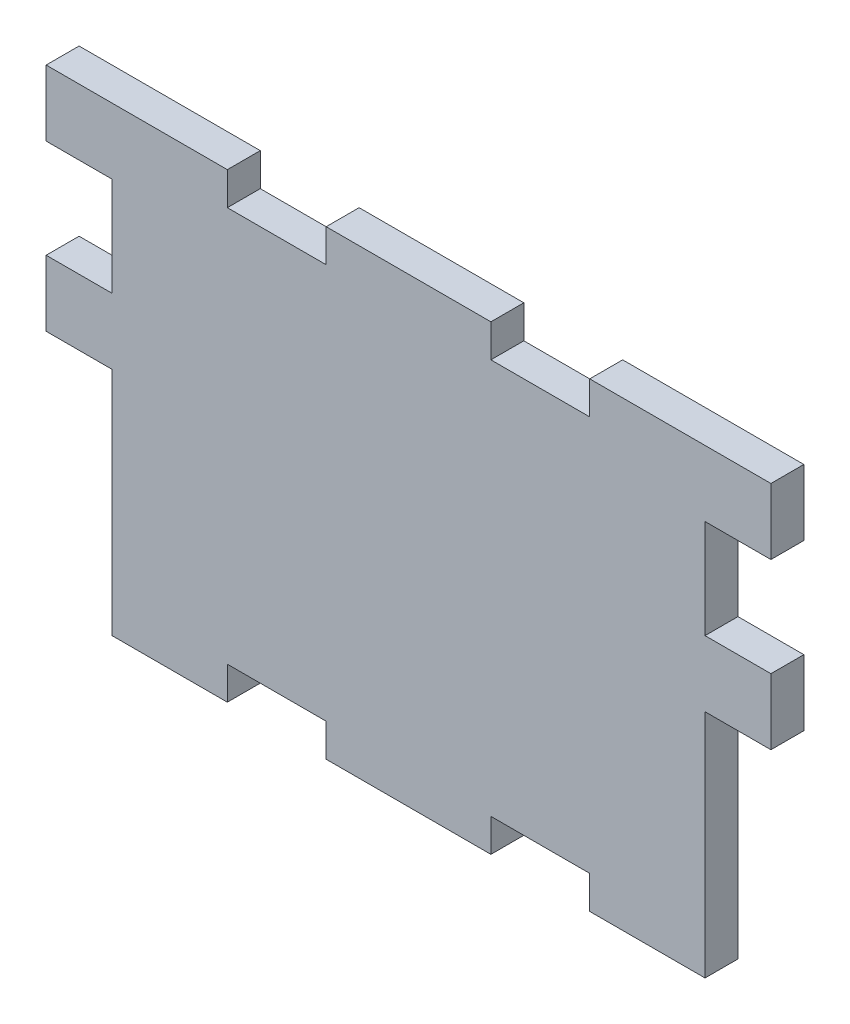
ISO-10303-21;
HEADER;
FILE_DESCRIPTION(('STEP AP214'),'2;1');
FILE_NAME('part.step','',(''),(''),'','','');
FILE_SCHEMA(('AUTOMOTIVE_DESIGN { 1 0 10303 214 1 1 1 1 }'));
ENDSEC;
DATA;
#1=APPLICATION_CONTEXT('core data for automotive mechanical design processes');
#2=APPLICATION_PROTOCOL_DEFINITION('international standard','automotive_design',2000,#1);
#3=PRODUCT_CONTEXT('',#1,'mechanical');
#4=PRODUCT('Part','Part','',(#3));
#5=PRODUCT_RELATED_PRODUCT_CATEGORY('part','',(#4));
#6=PRODUCT_DEFINITION_FORMATION('','',#4);
#7=PRODUCT_DEFINITION_CONTEXT('part definition',#1,'design');
#8=PRODUCT_DEFINITION('design','',#6,#7);
#9=PRODUCT_DEFINITION_SHAPE('','',#8);
#10=(LENGTH_UNIT() NAMED_UNIT(*) SI_UNIT(.MILLI.,.METRE.));
#11=(NAMED_UNIT(*) PLANE_ANGLE_UNIT() SI_UNIT($,.RADIAN.));
#12=(NAMED_UNIT(*) SI_UNIT($,.STERADIAN.) SOLID_ANGLE_UNIT());
#13=UNCERTAINTY_MEASURE_WITH_UNIT(LENGTH_MEASURE(1.E-05),#10,'distance_accuracy_value','');
#14=(GEOMETRIC_REPRESENTATION_CONTEXT(3) GLOBAL_UNCERTAINTY_ASSIGNED_CONTEXT((#13)) GLOBAL_UNIT_ASSIGNED_CONTEXT((#10,
#11,#12)) REPRESENTATION_CONTEXT('',''));
#15=CARTESIAN_POINT('',(0.,0.,0.));
#16=DIRECTION('',(0.,0.,1.));
#17=DIRECTION('',(1.,0.,0.));
#18=AXIS2_PLACEMENT_3D('',#15,#16,#17);
#19=CARTESIAN_POINT('',(55.,35.,5.));
#20=DIRECTION('',(-1.,0.,0.));
#21=DIRECTION('',(0.,-1.,0.));
#22=AXIS2_PLACEMENT_3D('',#19,#20,#21);
#23=PLANE('',#22);
#24=DIRECTION('',(0.,1.,0.));
#25=VECTOR('',#24,1.);
#26=CARTESIAN_POINT('',(55.,35.,5.));
#27=LINE('',#26,#25);
#28=CARTESIAN_POINT('',(55.,25.,5.));
#29=VERTEX_POINT('',#28);
#30=CARTESIAN_POINT('',(55.,35.,5.));
#31=VERTEX_POINT('',#30);
#32=EDGE_CURVE('E523',#29,#31,#27,.T.);
#33=ORIENTED_EDGE('',*,*,#32,.F.);
#34=DIRECTION('',(0.,0.,-1.));
#35=VECTOR('',#34,1.);
#36=CARTESIAN_POINT('',(55.,25.,5.));
#37=LINE('',#36,#35);
#38=CARTESIAN_POINT('',(55.,25.,0.));
#39=VERTEX_POINT('',#38);
#40=EDGE_CURVE('E393',#29,#39,#37,.T.);
#41=ORIENTED_EDGE('',*,*,#40,.T.);
#42=DIRECTION('',(0.,1.,0.));
#43=VECTOR('',#42,1.);
#44=CARTESIAN_POINT('',(55.,35.,0.));
#45=LINE('',#44,#43);
#46=CARTESIAN_POINT('',(55.,35.,0.));
#47=VERTEX_POINT('',#46);
#48=EDGE_CURVE('E517',#39,#47,#45,.T.);
#49=ORIENTED_EDGE('',*,*,#48,.T.);
#50=DIRECTION('',(0.,0.,-1.));
#51=VECTOR('',#50,1.);
#52=CARTESIAN_POINT('',(55.,35.,5.));
#53=LINE('',#52,#51);
#54=EDGE_CURVE('E11',#31,#47,#53,.T.);
#55=ORIENTED_EDGE('',*,*,#54,.F.);
#56=EDGE_LOOP('',(#33,#41,#49,#55));
#57=FACE_BOUND('',#56,.T.);
#58=ADVANCED_FACE('F43',(#57),#23,.F.);
#59=CARTESIAN_POINT('',(-55.,35.,5.));
#60=DIRECTION('',(0.,-1.,0.));
#61=DIRECTION('',(0.,0.,-1.));
#62=AXIS2_PLACEMENT_3D('',#59,#60,#61);
#63=PLANE('',#62);
#64=DIRECTION('',(-1.,0.,0.));
#65=VECTOR('',#64,1.);
#66=CARTESIAN_POINT('',(-55.,35.,0.));
#67=LINE('',#66,#65);
#68=CARTESIAN_POINT('',(27.5,35.,0.));
#69=VERTEX_POINT('',#68);
#70=EDGE_CURVE('E548',#47,#69,#67,.T.);
#71=ORIENTED_EDGE('',*,*,#70,.T.);
#72=DIRECTION('',(0.,0.,-1.));
#73=VECTOR('',#72,1.);
#74=CARTESIAN_POINT('',(27.5,35.,5.));
#75=LINE('',#74,#73);
#76=CARTESIAN_POINT('',(27.5,35.,5.));
#77=VERTEX_POINT('',#76);
#78=EDGE_CURVE('E325',#77,#69,#75,.T.);
#79=ORIENTED_EDGE('',*,*,#78,.F.);
#80=DIRECTION('',(-1.,0.,0.));
#81=VECTOR('',#80,1.);
#82=CARTESIAN_POINT('',(-55.,35.,5.));
#83=LINE('',#82,#81);
#84=EDGE_CURVE('E528',#31,#77,#83,.T.);
#85=ORIENTED_EDGE('',*,*,#84,.F.);
#86=ORIENTED_EDGE('',*,*,#54,.T.);
#87=EDGE_LOOP('',(#71,#79,#85,#86));
#88=FACE_BOUND('',#87,.T.);
#89=ADVANCED_FACE('F683',(#88),#63,.F.);
#90=CARTESIAN_POINT('',(12.5,35.,5.));
#91=VERTEX_POINT('',#90);
#92=CARTESIAN_POINT('',(-12.5,35.,5.));
#93=VERTEX_POINT('',#92);
#94=EDGE_CURVE('E533',#91,#93,#83,.T.);
#95=ORIENTED_EDGE('',*,*,#94,.F.);
#96=DIRECTION('',(0.,0.,-1.));
#97=VECTOR('',#96,1.);
#98=CARTESIAN_POINT('',(12.5,35.,5.));
#99=LINE('',#98,#97);
#100=CARTESIAN_POINT('',(12.5,35.,0.));
#101=VERTEX_POINT('',#100);
#102=EDGE_CURVE('E411',#91,#101,#99,.T.);
#103=ORIENTED_EDGE('',*,*,#102,.T.);
#104=CARTESIAN_POINT('',(-12.5,35.,0.));
#105=VERTEX_POINT('',#104);
#106=EDGE_CURVE('E553',#101,#105,#67,.T.);
#107=ORIENTED_EDGE('',*,*,#106,.T.);
#108=DIRECTION('',(0.,0.,-1.));
#109=VECTOR('',#108,1.);
#110=CARTESIAN_POINT('',(-12.5,35.,5.));
#111=LINE('',#110,#109);
#112=EDGE_CURVE('E311',#93,#105,#111,.T.);
#113=ORIENTED_EDGE('',*,*,#112,.F.);
#114=EDGE_LOOP('',(#95,#103,#107,#113));
#115=FACE_BOUND('',#114,.T.);
#116=ADVANCED_FACE('F616',(#115),#63,.F.);
#117=CARTESIAN_POINT('',(-55.,35.,5.));
#118=DIRECTION('',(1.,0.,0.));
#119=DIRECTION('',(0.,1.,0.));
#120=AXIS2_PLACEMENT_3D('',#117,#118,#119);
#121=PLANE('',#120);
#122=DIRECTION('',(0.,-1.,0.));
#123=VECTOR('',#122,1.);
#124=CARTESIAN_POINT('',(-55.,35.,5.));
#125=LINE('',#124,#123);
#126=CARTESIAN_POINT('',(-55.,10.,5.));
#127=VERTEX_POINT('',#126);
#128=CARTESIAN_POINT('',(-55.,0.,5.));
#129=VERTEX_POINT('',#128);
#130=EDGE_CURVE('E532',#127,#129,#125,.T.);
#131=ORIENTED_EDGE('',*,*,#130,.F.);
#132=DIRECTION('',(0.,0.,-1.));
#133=VECTOR('',#132,1.);
#134=CARTESIAN_POINT('',(-55.,10.,5.));
#135=LINE('',#134,#133);
#136=CARTESIAN_POINT('',(-55.,10.,0.));
#137=VERTEX_POINT('',#136);
#138=EDGE_CURVE('E377',#127,#137,#135,.T.);
#139=ORIENTED_EDGE('',*,*,#138,.T.);
#140=DIRECTION('',(0.,-1.,0.));
#141=VECTOR('',#140,1.);
#142=CARTESIAN_POINT('',(-55.,35.,0.));
#143=LINE('',#142,#141);
#144=CARTESIAN_POINT('',(-55.,0.,0.));
#145=VERTEX_POINT('',#144);
#146=EDGE_CURVE('E552',#137,#145,#143,.T.);
#147=ORIENTED_EDGE('',*,*,#146,.T.);
#148=DIRECTION('',(0.,0.,-1.));
#149=VECTOR('',#148,1.);
#150=CARTESIAN_POINT('',(-55.,0.,5.));
#151=LINE('',#150,#149);
#152=EDGE_CURVE('E437',#129,#145,#151,.T.);
#153=ORIENTED_EDGE('',*,*,#152,.F.);
#154=EDGE_LOOP('',(#131,#139,#147,#153));
#155=FACE_BOUND('',#154,.T.);
#156=ADVANCED_FACE('F648',(#155),#121,.F.);
#157=CARTESIAN_POINT('',(-55.,-35.,5.));
#158=DIRECTION('',(0.,1.,0.));
#159=DIRECTION('',(0.,0.,1.));
#160=AXIS2_PLACEMENT_3D('',#157,#158,#159);
#161=PLANE('',#160);
#162=DIRECTION('',(1.,0.,0.));
#163=VECTOR('',#162,1.);
#164=CARTESIAN_POINT('',(-55.,-35.,5.));
#165=LINE('',#164,#163);
#166=CARTESIAN_POINT('',(-12.5,-35.,5.));
#167=VERTEX_POINT('',#166);
#168=CARTESIAN_POINT('',(12.5,-35.,5.));
#169=VERTEX_POINT('',#168);
#170=EDGE_CURVE('E543',#167,#169,#165,.T.);
#171=ORIENTED_EDGE('',*,*,#170,.F.);
#172=DIRECTION('',(0.,0.,-1.));
#173=VECTOR('',#172,1.);
#174=CARTESIAN_POINT('',(-12.5,-35.,5.));
#175=LINE('',#174,#173);
#176=CARTESIAN_POINT('',(-12.5,-35.,0.));
#177=VERTEX_POINT('',#176);
#178=EDGE_CURVE('E294',#167,#177,#175,.T.);
#179=ORIENTED_EDGE('',*,*,#178,.T.);
#180=DIRECTION('',(1.,0.,0.));
#181=VECTOR('',#180,1.);
#182=CARTESIAN_POINT('',(-55.,-35.,0.));
#183=LINE('',#182,#181);
#184=CARTESIAN_POINT('',(12.5,-35.,0.));
#185=VERTEX_POINT('',#184);
#186=EDGE_CURVE('E280',#177,#185,#183,.T.);
#187=ORIENTED_EDGE('',*,*,#186,.T.);
#188=DIRECTION('',(0.,0.,-1.));
#189=VECTOR('',#188,1.);
#190=CARTESIAN_POINT('',(12.5,-35.,5.));
#191=LINE('',#190,#189);
#192=EDGE_CURVE('E341',#169,#185,#191,.T.);
#193=ORIENTED_EDGE('',*,*,#192,.F.);
#194=EDGE_LOOP('',(#171,#179,#187,#193));
#195=FACE_BOUND('',#194,.T.);
#196=ADVANCED_FACE('F578',(#195),#161,.F.);
#197=CARTESIAN_POINT('',(27.5,-35.,5.));
#198=VERTEX_POINT('',#197);
#199=CARTESIAN_POINT('',(45.,-35.,5.));
#200=VERTEX_POINT('',#199);
#201=EDGE_CURVE('E539',#198,#200,#165,.T.);
#202=ORIENTED_EDGE('',*,*,#201,.F.);
#203=DIRECTION('',(0.,0.,-1.));
#204=VECTOR('',#203,1.);
#205=CARTESIAN_POINT('',(27.5,-35.,5.));
#206=LINE('',#205,#204);
#207=CARTESIAN_POINT('',(27.5,-35.,0.));
#208=VERTEX_POINT('',#207);
#209=EDGE_CURVE('E336',#198,#208,#206,.T.);
#210=ORIENTED_EDGE('',*,*,#209,.T.);
#211=CARTESIAN_POINT('',(45.,-35.,0.));
#212=VERTEX_POINT('',#211);
#213=EDGE_CURVE('E559',#208,#212,#183,.T.);
#214=ORIENTED_EDGE('',*,*,#213,.T.);
#215=DIRECTION('',(0.,0.,-1.));
#216=VECTOR('',#215,1.);
#217=CARTESIAN_POINT('',(45.,-35.,5.));
#218=LINE('',#217,#216);
#219=EDGE_CURVE('E507',#200,#212,#218,.T.);
#220=ORIENTED_EDGE('',*,*,#219,.F.);
#221=EDGE_LOOP('',(#202,#210,#214,#220));
#222=FACE_BOUND('',#221,.T.);
#223=ADVANCED_FACE('F592',(#222),#161,.F.);
#224=CARTESIAN_POINT('',(55.,0.,0.));
#225=VERTEX_POINT('',#224);
#226=CARTESIAN_POINT('',(55.,10.,0.));
#227=VERTEX_POINT('',#226);
#228=EDGE_CURVE('E547',#225,#227,#45,.T.);
#229=ORIENTED_EDGE('',*,*,#228,.T.);
#230=DIRECTION('',(0.,0.,-1.));
#231=VECTOR('',#230,1.);
#232=CARTESIAN_POINT('',(55.,10.,5.));
#233=LINE('',#232,#231);
#234=CARTESIAN_POINT('',(55.,10.,5.));
#235=VERTEX_POINT('',#234);
#236=EDGE_CURVE('E464',#235,#227,#233,.T.);
#237=ORIENTED_EDGE('',*,*,#236,.F.);
#238=CARTESIAN_POINT('',(55.,0.,5.));
#239=VERTEX_POINT('',#238);
#240=EDGE_CURVE('E526',#239,#235,#27,.T.);
#241=ORIENTED_EDGE('',*,*,#240,.F.);
#242=DIRECTION('',(0.,0.,-1.));
#243=VECTOR('',#242,1.);
#244=CARTESIAN_POINT('',(55.,0.,5.));
#245=LINE('',#244,#243);
#246=EDGE_CURVE('E513',#239,#225,#245,.T.);
#247=ORIENTED_EDGE('',*,*,#246,.T.);
#248=EDGE_LOOP('',(#229,#237,#241,#247));
#249=FACE_BOUND('',#248,.T.);
#250=ADVANCED_FACE('F45',(#249),#23,.F.);
#251=CARTESIAN_POINT('',(-27.5,35.,5.));
#252=VERTEX_POINT('',#251);
#253=CARTESIAN_POINT('',(-55.,35.,5.));
#254=VERTEX_POINT('',#253);
#255=EDGE_CURVE('E534',#252,#254,#83,.T.);
#256=ORIENTED_EDGE('',*,*,#255,.F.);
#257=DIRECTION('',(0.,0.,-1.));
#258=VECTOR('',#257,1.);
#259=CARTESIAN_POINT('',(-27.5,35.,5.));
#260=LINE('',#259,#258);
#261=CARTESIAN_POINT('',(-27.5,35.,0.));
#262=VERTEX_POINT('',#261);
#263=EDGE_CURVE('E307',#252,#262,#260,.T.);
#264=ORIENTED_EDGE('',*,*,#263,.T.);
#265=CARTESIAN_POINT('',(-55.,35.,0.));
#266=VERTEX_POINT('',#265);
#267=EDGE_CURVE('E554',#262,#266,#67,.T.);
#268=ORIENTED_EDGE('',*,*,#267,.T.);
#269=DIRECTION('',(0.,0.,-1.));
#270=VECTOR('',#269,1.);
#271=CARTESIAN_POINT('',(-55.,35.,5.));
#272=LINE('',#271,#270);
#273=EDGE_CURVE('E52',#254,#266,#272,.T.);
#274=ORIENTED_EDGE('',*,*,#273,.F.);
#275=EDGE_LOOP('',(#256,#264,#268,#274));
#276=FACE_BOUND('',#275,.T.);
#277=ADVANCED_FACE('F630',(#276),#63,.F.);
#278=CARTESIAN_POINT('',(-55.,25.,0.));
#279=VERTEX_POINT('',#278);
#280=EDGE_CURVE('E555',#266,#279,#143,.T.);
#281=ORIENTED_EDGE('',*,*,#280,.T.);
#282=DIRECTION('',(0.,0.,-1.));
#283=VECTOR('',#282,1.);
#284=CARTESIAN_POINT('',(-55.,25.,5.));
#285=LINE('',#284,#283);
#286=CARTESIAN_POINT('',(-55.,25.,5.));
#287=VERTEX_POINT('',#286);
#288=EDGE_CURVE('E367',#287,#279,#285,.T.);
#289=ORIENTED_EDGE('',*,*,#288,.F.);
#290=EDGE_CURVE('E535',#254,#287,#125,.T.);
#291=ORIENTED_EDGE('',*,*,#290,.F.);
#292=ORIENTED_EDGE('',*,*,#273,.T.);
#293=EDGE_LOOP('',(#281,#289,#291,#292));
#294=FACE_BOUND('',#293,.T.);
#295=ADVANCED_FACE('F632',(#294),#121,.F.);
#296=CARTESIAN_POINT('',(-45.,-35.,5.));
#297=VERTEX_POINT('',#296);
#298=CARTESIAN_POINT('',(-27.5,-35.,5.));
#299=VERTEX_POINT('',#298);
#300=EDGE_CURVE('E544',#297,#299,#165,.T.);
#301=ORIENTED_EDGE('',*,*,#300,.F.);
#302=DIRECTION('',(0.,0.,-1.));
#303=VECTOR('',#302,1.);
#304=CARTESIAN_POINT('',(-45.,-35.,5.));
#305=LINE('',#304,#303);
#306=CARTESIAN_POINT('',(-45.,-35.,0.));
#307=VERTEX_POINT('',#306);
#308=EDGE_CURVE('E444',#297,#307,#305,.T.);
#309=ORIENTED_EDGE('',*,*,#308,.T.);
#310=CARTESIAN_POINT('',(-27.5,-35.,0.));
#311=VERTEX_POINT('',#310);
#312=EDGE_CURVE('E527',#307,#311,#183,.T.);
#313=ORIENTED_EDGE('',*,*,#312,.T.);
#314=DIRECTION('',(0.,0.,-1.));
#315=VECTOR('',#314,1.);
#316=CARTESIAN_POINT('',(-27.5,-35.,5.));
#317=LINE('',#316,#315);
#318=EDGE_CURVE('E664',#299,#311,#317,.T.);
#319=ORIENTED_EDGE('',*,*,#318,.F.);
#320=EDGE_LOOP('',(#301,#309,#313,#319));
#321=FACE_BOUND('',#320,.T.);
#322=ADVANCED_FACE('F662',(#321),#161,.F.);
#323=CARTESIAN_POINT('',(0.,0.,5.));
#324=DIRECTION('',(0.,0.,1.));
#325=DIRECTION('',(1.,0.,0.));
#326=AXIS2_PLACEMENT_3D('',#323,#324,#325);
#327=PLANE('',#326);
#328=DIRECTION('',(0.,-1.,0.));
#329=VECTOR('',#328,1.);
#330=CARTESIAN_POINT('',(27.5,35.,5.));
#331=LINE('',#330,#329);
#332=CARTESIAN_POINT('',(27.5,30.,5.));
#333=VERTEX_POINT('',#332);
#334=EDGE_CURVE('E421',#77,#333,#331,.T.);
#335=ORIENTED_EDGE('',*,*,#334,.T.);
#336=DIRECTION('',(-1.,0.,0.));
#337=VECTOR('',#336,1.);
#338=CARTESIAN_POINT('',(27.5,30.,5.));
#339=LINE('',#338,#337);
#340=CARTESIAN_POINT('',(12.5,30.,5.));
#341=VERTEX_POINT('',#340);
#342=EDGE_CURVE('E430',#333,#341,#339,.T.);
#343=ORIENTED_EDGE('',*,*,#342,.T.);
#344=DIRECTION('',(0.,1.,0.));
#345=VECTOR('',#344,1.);
#346=CARTESIAN_POINT('',(12.5,35.,5.));
#347=LINE('',#346,#345);
#348=EDGE_CURVE('E407',#341,#91,#347,.T.);
#349=ORIENTED_EDGE('',*,*,#348,.T.);
#350=ORIENTED_EDGE('',*,*,#94,.T.);
#351=DIRECTION('',(0.,-1.,0.));
#352=VECTOR('',#351,1.);
#353=CARTESIAN_POINT('',(-12.5,35.,5.));
#354=LINE('',#353,#352);
#355=CARTESIAN_POINT('',(-12.5,30.,5.));
#356=VERTEX_POINT('',#355);
#357=EDGE_CURVE('E319',#93,#356,#354,.T.);
#358=ORIENTED_EDGE('',*,*,#357,.T.);
#359=DIRECTION('',(-1.,0.,0.));
#360=VECTOR('',#359,1.);
#361=CARTESIAN_POINT('',(-12.5,30.,5.));
#362=LINE('',#361,#360);
#363=CARTESIAN_POINT('',(-27.5,30.,5.));
#364=VERTEX_POINT('',#363);
#365=EDGE_CURVE('E329',#356,#364,#362,.T.);
#366=ORIENTED_EDGE('',*,*,#365,.T.);
#367=DIRECTION('',(0.,1.,0.));
#368=VECTOR('',#367,1.);
#369=CARTESIAN_POINT('',(-27.5,35.,5.));
#370=LINE('',#369,#368);
#371=EDGE_CURVE('E303',#364,#252,#370,.T.);
#372=ORIENTED_EDGE('',*,*,#371,.T.);
#373=ORIENTED_EDGE('',*,*,#255,.T.);
#374=ORIENTED_EDGE('',*,*,#290,.T.);
#375=DIRECTION('',(1.,0.,0.));
#376=VECTOR('',#375,1.);
#377=CARTESIAN_POINT('',(-55.,25.,5.));
#378=LINE('',#377,#376);
#379=CARTESIAN_POINT('',(-45.,25.,5.));
#380=VERTEX_POINT('',#379);
#381=EDGE_CURVE('E385',#287,#380,#378,.T.);
#382=ORIENTED_EDGE('',*,*,#381,.T.);
#383=DIRECTION('',(0.,-1.,0.));
#384=VECTOR('',#383,1.);
#385=CARTESIAN_POINT('',(-45.,25.,5.));
#386=LINE('',#385,#384);
#387=CARTESIAN_POINT('',(-45.,10.,5.));
#388=VERTEX_POINT('',#387);
#389=EDGE_CURVE('E397',#380,#388,#386,.T.);
#390=ORIENTED_EDGE('',*,*,#389,.T.);
#391=DIRECTION('',(-1.,0.,0.));
#392=VECTOR('',#391,1.);
#393=CARTESIAN_POINT('',(-55.,10.,5.));
#394=LINE('',#393,#392);
#395=EDGE_CURVE('E370',#388,#127,#394,.T.);
#396=ORIENTED_EDGE('',*,*,#395,.T.);
#397=ORIENTED_EDGE('',*,*,#130,.T.);
#398=DIRECTION('',(1.,0.,0.));
#399=VECTOR('',#398,1.);
#400=CARTESIAN_POINT('',(-55.,0.,5.));
#401=LINE('',#400,#399);
#402=CARTESIAN_POINT('',(-45.,0.,5.));
#403=VERTEX_POINT('',#402);
#404=EDGE_CURVE('E453',#129,#403,#401,.T.);
#405=ORIENTED_EDGE('',*,*,#404,.T.);
#406=DIRECTION('',(0.,-1.,0.));
#407=VECTOR('',#406,1.);
#408=CARTESIAN_POINT('',(-45.,-35.,5.));
#409=LINE('',#408,#407);
#410=EDGE_CURVE('E440',#403,#297,#409,.T.);
#411=ORIENTED_EDGE('',*,*,#410,.T.);
#412=ORIENTED_EDGE('',*,*,#300,.T.);
#413=DIRECTION('',(0.,1.,0.));
#414=VECTOR('',#413,1.);
#415=CARTESIAN_POINT('',(-27.5,-35.,5.));
#416=LINE('',#415,#414);
#417=CARTESIAN_POINT('',(-27.5,-30.,5.));
#418=VERTEX_POINT('',#417);
#419=EDGE_CURVE('E293',#299,#418,#416,.T.);
#420=ORIENTED_EDGE('',*,*,#419,.T.);
#421=DIRECTION('',(1.,0.,0.));
#422=VECTOR('',#421,1.);
#423=CARTESIAN_POINT('',(-12.5,-30.,5.));
#424=LINE('',#423,#422);
#425=CARTESIAN_POINT('',(-12.5,-30.,5.));
#426=VERTEX_POINT('',#425);
#427=EDGE_CURVE('E290',#418,#426,#424,.T.);
#428=ORIENTED_EDGE('',*,*,#427,.T.);
#429=DIRECTION('',(0.,-1.,0.));
#430=VECTOR('',#429,1.);
#431=CARTESIAN_POINT('',(-12.5,-35.,5.));
#432=LINE('',#431,#430);
#433=EDGE_CURVE('E259',#426,#167,#432,.T.);
#434=ORIENTED_EDGE('',*,*,#433,.T.);
#435=ORIENTED_EDGE('',*,*,#170,.T.);
#436=DIRECTION('',(0.,1.,0.));
#437=VECTOR('',#436,1.);
#438=CARTESIAN_POINT('',(12.5,-35.,5.));
#439=LINE('',#438,#437);
#440=CARTESIAN_POINT('',(12.5,-30.,5.));
#441=VERTEX_POINT('',#440);
#442=EDGE_CURVE('E360',#169,#441,#439,.T.);
#443=ORIENTED_EDGE('',*,*,#442,.T.);
#444=DIRECTION('',(1.,0.,0.));
#445=VECTOR('',#444,1.);
#446=CARTESIAN_POINT('',(27.5,-30.,5.));
#447=LINE('',#446,#445);
#448=CARTESIAN_POINT('',(27.5,-30.,5.));
#449=VERTEX_POINT('',#448);
#450=EDGE_CURVE('E340',#441,#449,#447,.T.);
#451=ORIENTED_EDGE('',*,*,#450,.T.);
#452=DIRECTION('',(0.,-1.,0.));
#453=VECTOR('',#452,1.);
#454=CARTESIAN_POINT('',(27.5,-35.,5.));
#455=LINE('',#454,#453);
#456=EDGE_CURVE('E351',#449,#198,#455,.T.);
#457=ORIENTED_EDGE('',*,*,#456,.T.);
#458=ORIENTED_EDGE('',*,*,#201,.T.);
#459=DIRECTION('',(0.,1.,0.));
#460=VECTOR('',#459,1.);
#461=CARTESIAN_POINT('',(45.,-35.,5.));
#462=LINE('',#461,#460);
#463=CARTESIAN_POINT('',(45.,0.,5.));
#464=VERTEX_POINT('',#463);
#465=EDGE_CURVE('E498',#200,#464,#462,.T.);
#466=ORIENTED_EDGE('',*,*,#465,.T.);
#467=DIRECTION('',(1.,0.,0.));
#468=VECTOR('',#467,1.);
#469=CARTESIAN_POINT('',(55.,0.,5.));
#470=LINE('',#469,#468);
#471=EDGE_CURVE('E502',#464,#239,#470,.T.);
#472=ORIENTED_EDGE('',*,*,#471,.T.);
#473=ORIENTED_EDGE('',*,*,#240,.T.);
#474=DIRECTION('',(-1.,0.,0.));
#475=VECTOR('',#474,1.);
#476=CARTESIAN_POINT('',(55.,10.,5.));
#477=LINE('',#476,#475);
#478=CARTESIAN_POINT('',(45.,10.,5.));
#479=VERTEX_POINT('',#478);
#480=EDGE_CURVE('E481',#235,#479,#477,.T.);
#481=ORIENTED_EDGE('',*,*,#480,.T.);
#482=DIRECTION('',(0.,1.,0.));
#483=VECTOR('',#482,1.);
#484=CARTESIAN_POINT('',(45.,25.,5.));
#485=LINE('',#484,#483);
#486=CARTESIAN_POINT('',(45.,25.,5.));
#487=VERTEX_POINT('',#486);
#488=EDGE_CURVE('E491',#479,#487,#485,.T.);
#489=ORIENTED_EDGE('',*,*,#488,.T.);
#490=DIRECTION('',(1.,0.,0.));
#491=VECTOR('',#490,1.);
#492=CARTESIAN_POINT('',(55.,25.,5.));
#493=LINE('',#492,#491);
#494=EDGE_CURVE('E467',#487,#29,#493,.T.);
#495=ORIENTED_EDGE('',*,*,#494,.T.);
#496=ORIENTED_EDGE('',*,*,#32,.T.);
#497=ORIENTED_EDGE('',*,*,#84,.T.);
#498=EDGE_LOOP('',(#335,#343,#349,#350,#358,#366,#372,#373,#374,#382,#390,#396,#397,#405,#411,
#412,#420,#428,#434,#435,#443,#451,#457,#458,#466,#472,#473,#481,#489,#495,#496,#497));
#499=FACE_BOUND('',#498,.T.);
#500=ADVANCED_FACE('F575',(#499),#327,.T.);
#501=CARTESIAN_POINT('',(0.,0.,0.));
#502=DIRECTION('',(0.,0.,1.));
#503=DIRECTION('',(1.,0.,0.));
#504=AXIS2_PLACEMENT_3D('',#501,#502,#503);
#505=PLANE('',#504);
#506=DIRECTION('',(-1.,0.,0.));
#507=VECTOR('',#506,1.);
#508=CARTESIAN_POINT('',(27.5,30.,0.));
#509=LINE('',#508,#507);
#510=CARTESIAN_POINT('',(27.5,30.,0.));
#511=VERTEX_POINT('',#510);
#512=CARTESIAN_POINT('',(12.5,30.,0.));
#513=VERTEX_POINT('',#512);
#514=EDGE_CURVE('E420',#511,#513,#509,.T.);
#515=ORIENTED_EDGE('',*,*,#514,.F.);
#516=DIRECTION('',(0.,-1.,0.));
#517=VECTOR('',#516,1.);
#518=CARTESIAN_POINT('',(27.5,35.,0.));
#519=LINE('',#518,#517);
#520=EDGE_CURVE('E59',#69,#511,#519,.T.);
#521=ORIENTED_EDGE('',*,*,#520,.F.);
#522=ORIENTED_EDGE('',*,*,#70,.F.);
#523=ORIENTED_EDGE('',*,*,#48,.F.);
#524=DIRECTION('',(1.,0.,0.));
#525=VECTOR('',#524,1.);
#526=CARTESIAN_POINT('',(55.,25.,0.));
#527=LINE('',#526,#525);
#528=CARTESIAN_POINT('',(45.,25.,0.));
#529=VERTEX_POINT('',#528);
#530=EDGE_CURVE('E477',#529,#39,#527,.T.);
#531=ORIENTED_EDGE('',*,*,#530,.F.);
#532=DIRECTION('',(0.,1.,0.));
#533=VECTOR('',#532,1.);
#534=CARTESIAN_POINT('',(45.,25.,0.));
#535=LINE('',#534,#533);
#536=CARTESIAN_POINT('',(45.,10.,0.));
#537=VERTEX_POINT('',#536);
#538=EDGE_CURVE('E480',#537,#529,#535,.T.);
#539=ORIENTED_EDGE('',*,*,#538,.F.);
#540=DIRECTION('',(-1.,0.,0.));
#541=VECTOR('',#540,1.);
#542=CARTESIAN_POINT('',(55.,10.,0.));
#543=LINE('',#542,#541);
#544=EDGE_CURVE('E448',#227,#537,#543,.T.);
#545=ORIENTED_EDGE('',*,*,#544,.F.);
#546=ORIENTED_EDGE('',*,*,#228,.F.);
#547=DIRECTION('',(1.,0.,0.));
#548=VECTOR('',#547,1.);
#549=CARTESIAN_POINT('',(55.,0.,0.));
#550=LINE('',#549,#548);
#551=CARTESIAN_POINT('',(45.,0.,0.));
#552=VERTEX_POINT('',#551);
#553=EDGE_CURVE('E503',#552,#225,#550,.T.);
#554=ORIENTED_EDGE('',*,*,#553,.F.);
#555=DIRECTION('',(0.,1.,0.));
#556=VECTOR('',#555,1.);
#557=CARTESIAN_POINT('',(45.,-35.,0.));
#558=LINE('',#557,#556);
#559=EDGE_CURVE('E457',#212,#552,#558,.T.);
#560=ORIENTED_EDGE('',*,*,#559,.F.);
#561=ORIENTED_EDGE('',*,*,#213,.F.);
#562=DIRECTION('',(0.,-1.,0.));
#563=VECTOR('',#562,1.);
#564=CARTESIAN_POINT('',(27.5,-35.,0.));
#565=LINE('',#564,#563);
#566=CARTESIAN_POINT('',(27.5,-30.,0.));
#567=VERTEX_POINT('',#566);
#568=EDGE_CURVE('E314',#567,#208,#565,.T.);
#569=ORIENTED_EDGE('',*,*,#568,.F.);
#570=DIRECTION('',(1.,0.,0.));
#571=VECTOR('',#570,1.);
#572=CARTESIAN_POINT('',(27.5,-30.,0.));
#573=LINE('',#572,#571);
#574=CARTESIAN_POINT('',(12.5,-30.,0.));
#575=VERTEX_POINT('',#574);
#576=EDGE_CURVE('E346',#575,#567,#573,.T.);
#577=ORIENTED_EDGE('',*,*,#576,.F.);
#578=DIRECTION('',(0.,1.,0.));
#579=VECTOR('',#578,1.);
#580=CARTESIAN_POINT('',(12.5,-35.,0.));
#581=LINE('',#580,#579);
#582=EDGE_CURVE('E350',#185,#575,#581,.T.);
#583=ORIENTED_EDGE('',*,*,#582,.F.);
#584=ORIENTED_EDGE('',*,*,#186,.F.);
#585=DIRECTION('',(0.,-1.,0.));
#586=VECTOR('',#585,1.);
#587=CARTESIAN_POINT('',(-12.5,-35.,0.));
#588=LINE('',#587,#586);
#589=CARTESIAN_POINT('',(-12.5,-30.,0.));
#590=VERTEX_POINT('',#589);
#591=EDGE_CURVE('E256',#590,#177,#588,.T.);
#592=ORIENTED_EDGE('',*,*,#591,.F.);
#593=DIRECTION('',(1.,0.,0.));
#594=VECTOR('',#593,1.);
#595=CARTESIAN_POINT('',(-12.5,-30.,0.));
#596=LINE('',#595,#594);
#597=CARTESIAN_POINT('',(-27.5,-30.,0.));
#598=VERTEX_POINT('',#597);
#599=EDGE_CURVE('E267',#598,#590,#596,.T.);
#600=ORIENTED_EDGE('',*,*,#599,.F.);
#601=DIRECTION('',(0.,1.,0.));
#602=VECTOR('',#601,1.);
#603=CARTESIAN_POINT('',(-27.5,-35.,0.));
#604=LINE('',#603,#602);
#605=EDGE_CURVE('E273',#311,#598,#604,.T.);
#606=ORIENTED_EDGE('',*,*,#605,.F.);
#607=ORIENTED_EDGE('',*,*,#312,.F.);
#608=DIRECTION('',(0.,-1.,0.));
#609=VECTOR('',#608,1.);
#610=CARTESIAN_POINT('',(-45.,-35.,0.));
#611=LINE('',#610,#609);
#612=CARTESIAN_POINT('',(-45.,0.,0.));
#613=VERTEX_POINT('',#612);
#614=EDGE_CURVE('E449',#613,#307,#611,.T.);
#615=ORIENTED_EDGE('',*,*,#614,.F.);
#616=DIRECTION('',(1.,0.,0.));
#617=VECTOR('',#616,1.);
#618=CARTESIAN_POINT('',(-55.,0.,0.));
#619=LINE('',#618,#617);
#620=EDGE_CURVE('E452',#145,#613,#619,.T.);
#621=ORIENTED_EDGE('',*,*,#620,.F.);
#622=ORIENTED_EDGE('',*,*,#146,.F.);
#623=DIRECTION('',(-1.,0.,0.));
#624=VECTOR('',#623,1.);
#625=CARTESIAN_POINT('',(-55.,10.,0.));
#626=LINE('',#625,#624);
#627=CARTESIAN_POINT('',(-45.,10.,0.));
#628=VERTEX_POINT('',#627);
#629=EDGE_CURVE('E381',#628,#137,#626,.T.);
#630=ORIENTED_EDGE('',*,*,#629,.F.);
#631=DIRECTION('',(0.,-1.,0.));
#632=VECTOR('',#631,1.);
#633=CARTESIAN_POINT('',(-45.,25.,0.));
#634=LINE('',#633,#632);
#635=CARTESIAN_POINT('',(-45.,25.,0.));
#636=VERTEX_POINT('',#635);
#637=EDGE_CURVE('E384',#636,#628,#634,.T.);
#638=ORIENTED_EDGE('',*,*,#637,.F.);
#639=DIRECTION('',(1.,0.,0.));
#640=VECTOR('',#639,1.);
#641=CARTESIAN_POINT('',(-55.,25.,0.));
#642=LINE('',#641,#640);
#643=EDGE_CURVE('E389',#279,#636,#642,.T.);
#644=ORIENTED_EDGE('',*,*,#643,.F.);
#645=ORIENTED_EDGE('',*,*,#280,.F.);
#646=ORIENTED_EDGE('',*,*,#267,.F.);
#647=DIRECTION('',(0.,1.,0.));
#648=VECTOR('',#647,1.);
#649=CARTESIAN_POINT('',(-27.5,35.,0.));
#650=LINE('',#649,#648);
#651=CARTESIAN_POINT('',(-27.5,30.,0.));
#652=VERTEX_POINT('',#651);
#653=EDGE_CURVE('E315',#652,#262,#650,.T.);
#654=ORIENTED_EDGE('',*,*,#653,.F.);
#655=DIRECTION('',(-1.,0.,0.));
#656=VECTOR('',#655,1.);
#657=CARTESIAN_POINT('',(-12.5,30.,0.));
#658=LINE('',#657,#656);
#659=CARTESIAN_POINT('',(-12.5,30.,0.));
#660=VERTEX_POINT('',#659);
#661=EDGE_CURVE('E318',#660,#652,#658,.T.);
#662=ORIENTED_EDGE('',*,*,#661,.F.);
#663=DIRECTION('',(0.,-1.,0.));
#664=VECTOR('',#663,1.);
#665=CARTESIAN_POINT('',(-12.5,35.,0.));
#666=LINE('',#665,#664);
#667=EDGE_CURVE('E67',#105,#660,#666,.T.);
#668=ORIENTED_EDGE('',*,*,#667,.F.);
#669=ORIENTED_EDGE('',*,*,#106,.F.);
#670=DIRECTION('',(0.,1.,0.));
#671=VECTOR('',#670,1.);
#672=CARTESIAN_POINT('',(12.5,35.,0.));
#673=LINE('',#672,#671);
#674=EDGE_CURVE('E417',#513,#101,#673,.T.);
#675=ORIENTED_EDGE('',*,*,#674,.F.);
#676=EDGE_LOOP('',(#515,#521,#522,#523,#531,#539,#545,#546,#554,#560,#561,#569,#577,#583,#584,
#592,#600,#606,#607,#615,#621,#622,#630,#638,#644,#645,#646,#654,#662,#668,#669,#675));
#677=FACE_BOUND('',#676,.T.);
#678=ADVANCED_FACE('F277',(#677),#505,.F.);
#679=CARTESIAN_POINT('',(55.,0.,5.));
#680=DIRECTION('',(0.,1.,0.));
#681=DIRECTION('',(0.,0.,1.));
#682=AXIS2_PLACEMENT_3D('',#679,#680,#681);
#683=PLANE('',#682);
#684=ORIENTED_EDGE('',*,*,#553,.T.);
#685=ORIENTED_EDGE('',*,*,#246,.F.);
#686=ORIENTED_EDGE('',*,*,#471,.F.);
#687=DIRECTION('',(0.,0.,-1.));
#688=VECTOR('',#687,1.);
#689=CARTESIAN_POINT('',(45.,0.,5.));
#690=LINE('',#689,#688);
#691=EDGE_CURVE('E518',#464,#552,#690,.T.);
#692=ORIENTED_EDGE('',*,*,#691,.T.);
#693=EDGE_LOOP('',(#684,#685,#686,#692));
#694=FACE_BOUND('',#693,.T.);
#695=ADVANCED_FACE('F601',(#694),#683,.F.);
#696=CARTESIAN_POINT('',(45.,-35.,5.));
#697=DIRECTION('',(-1.,0.,0.));
#698=DIRECTION('',(0.,0.,1.));
#699=AXIS2_PLACEMENT_3D('',#696,#697,#698);
#700=PLANE('',#699);
#701=ORIENTED_EDGE('',*,*,#559,.T.);
#702=ORIENTED_EDGE('',*,*,#691,.F.);
#703=ORIENTED_EDGE('',*,*,#465,.F.);
#704=ORIENTED_EDGE('',*,*,#219,.T.);
#705=EDGE_LOOP('',(#701,#702,#703,#704));
#706=FACE_BOUND('',#705,.T.);
#707=ADVANCED_FACE('F595',(#706),#700,.F.);
#708=CARTESIAN_POINT('',(-12.5,35.,5.));
#709=DIRECTION('',(1.,0.,0.));
#710=DIRECTION('',(0.,1.,0.));
#711=AXIS2_PLACEMENT_3D('',#708,#709,#710);
#712=PLANE('',#711);
#713=ORIENTED_EDGE('',*,*,#667,.T.);
#714=DIRECTION('',(0.,0.,-1.));
#715=VECTOR('',#714,1.);
#716=CARTESIAN_POINT('',(-12.5,30.,5.));
#717=LINE('',#716,#715);
#718=EDGE_CURVE('E300',#356,#660,#717,.T.);
#719=ORIENTED_EDGE('',*,*,#718,.F.);
#720=ORIENTED_EDGE('',*,*,#357,.F.);
#721=ORIENTED_EDGE('',*,*,#112,.T.);
#722=EDGE_LOOP('',(#713,#719,#720,#721));
#723=FACE_BOUND('',#722,.T.);
#724=ADVANCED_FACE('F619',(#723),#712,.F.);
#725=CARTESIAN_POINT('',(-27.5,35.,5.));
#726=DIRECTION('',(-1.,0.,0.));
#727=DIRECTION('',(0.,-1.,0.));
#728=AXIS2_PLACEMENT_3D('',#725,#726,#727);
#729=PLANE('',#728);
#730=ORIENTED_EDGE('',*,*,#653,.T.);
#731=ORIENTED_EDGE('',*,*,#263,.F.);
#732=ORIENTED_EDGE('',*,*,#371,.F.);
#733=DIRECTION('',(0.,0.,-1.));
#734=VECTOR('',#733,1.);
#735=CARTESIAN_POINT('',(-27.5,30.,5.));
#736=LINE('',#735,#734);
#737=EDGE_CURVE('E304',#364,#652,#736,.T.);
#738=ORIENTED_EDGE('',*,*,#737,.T.);
#739=EDGE_LOOP('',(#730,#731,#732,#738));
#740=FACE_BOUND('',#739,.T.);
#741=ADVANCED_FACE('F753',(#740),#729,.F.);
#742=CARTESIAN_POINT('',(-12.5,30.,5.));
#743=DIRECTION('',(0.,-1.,0.));
#744=DIRECTION('',(0.,0.,-1.));
#745=AXIS2_PLACEMENT_3D('',#742,#743,#744);
#746=PLANE('',#745);
#747=ORIENTED_EDGE('',*,*,#661,.T.);
#748=ORIENTED_EDGE('',*,*,#737,.F.);
#749=ORIENTED_EDGE('',*,*,#365,.F.);
#750=ORIENTED_EDGE('',*,*,#718,.T.);
#751=EDGE_LOOP('',(#747,#748,#749,#750));
#752=FACE_BOUND('',#751,.T.);
#753=ADVANCED_FACE('F625',(#752),#746,.F.);
#754=CARTESIAN_POINT('',(27.5,-35.,5.));
#755=DIRECTION('',(1.,0.,0.));
#756=DIRECTION('',(0.,1.,0.));
#757=AXIS2_PLACEMENT_3D('',#754,#755,#756);
#758=PLANE('',#757);
#759=ORIENTED_EDGE('',*,*,#568,.T.);
#760=ORIENTED_EDGE('',*,*,#209,.F.);
#761=ORIENTED_EDGE('',*,*,#456,.F.);
#762=DIRECTION('',(0.,0.,-1.));
#763=VECTOR('',#762,1.);
#764=CARTESIAN_POINT('',(27.5,-30.,5.));
#765=LINE('',#764,#763);
#766=EDGE_CURVE('E282',#449,#567,#765,.T.);
#767=ORIENTED_EDGE('',*,*,#766,.T.);
#768=EDGE_LOOP('',(#759,#760,#761,#767));
#769=FACE_BOUND('',#768,.T.);
#770=ADVANCED_FACE('F770',(#769),#758,.F.);
#771=CARTESIAN_POINT('',(27.5,-30.,5.));
#772=DIRECTION('',(0.,1.,0.));
#773=DIRECTION('',(0.,0.,1.));
#774=AXIS2_PLACEMENT_3D('',#771,#772,#773);
#775=PLANE('',#774);
#776=ORIENTED_EDGE('',*,*,#576,.T.);
#777=ORIENTED_EDGE('',*,*,#766,.F.);
#778=ORIENTED_EDGE('',*,*,#450,.F.);
#779=DIRECTION('',(0.,0.,-1.));
#780=VECTOR('',#779,1.);
#781=CARTESIAN_POINT('',(12.5,-30.,5.));
#782=LINE('',#781,#780);
#783=EDGE_CURVE('E286',#441,#575,#782,.T.);
#784=ORIENTED_EDGE('',*,*,#783,.T.);
#785=EDGE_LOOP('',(#776,#777,#778,#784));
#786=FACE_BOUND('',#785,.T.);
#787=ADVANCED_FACE('F585',(#786),#775,.F.);
#788=CARTESIAN_POINT('',(12.5,-35.,5.));
#789=DIRECTION('',(-1.,0.,0.));
#790=DIRECTION('',(0.,0.,1.));
#791=AXIS2_PLACEMENT_3D('',#788,#789,#790);
#792=PLANE('',#791);
#793=ORIENTED_EDGE('',*,*,#582,.T.);
#794=ORIENTED_EDGE('',*,*,#783,.F.);
#795=ORIENTED_EDGE('',*,*,#442,.F.);
#796=ORIENTED_EDGE('',*,*,#192,.T.);
#797=EDGE_LOOP('',(#793,#794,#795,#796));
#798=FACE_BOUND('',#797,.T.);
#799=ADVANCED_FACE('F580',(#798),#792,.F.);
#800=CARTESIAN_POINT('',(-12.5,-35.,5.));
#801=DIRECTION('',(1.,0.,0.));
#802=DIRECTION('',(0.,0.,-1.));
#803=AXIS2_PLACEMENT_3D('',#800,#801,#802);
#804=PLANE('',#803);
#805=ORIENTED_EDGE('',*,*,#591,.T.);
#806=ORIENTED_EDGE('',*,*,#178,.F.);
#807=ORIENTED_EDGE('',*,*,#433,.F.);
#808=DIRECTION('',(0.,0.,-1.));
#809=VECTOR('',#808,1.);
#810=CARTESIAN_POINT('',(-12.5,-30.,5.));
#811=LINE('',#810,#809);
#812=EDGE_CURVE('E252',#426,#590,#811,.T.);
#813=ORIENTED_EDGE('',*,*,#812,.T.);
#814=EDGE_LOOP('',(#805,#806,#807,#813));
#815=FACE_BOUND('',#814,.T.);
#816=ADVANCED_FACE('F254',(#815),#804,.F.);
#817=CARTESIAN_POINT('',(-12.5,-30.,5.));
#818=DIRECTION('',(0.,1.,0.));
#819=DIRECTION('',(0.,0.,1.));
#820=AXIS2_PLACEMENT_3D('',#817,#818,#819);
#821=PLANE('',#820);
#822=ORIENTED_EDGE('',*,*,#599,.T.);
#823=ORIENTED_EDGE('',*,*,#812,.F.);
#824=ORIENTED_EDGE('',*,*,#427,.F.);
#825=DIRECTION('',(0.,0.,-1.));
#826=VECTOR('',#825,1.);
#827=CARTESIAN_POINT('',(-27.5,-30.,5.));
#828=LINE('',#827,#826);
#829=EDGE_CURVE('E264',#418,#598,#828,.T.);
#830=ORIENTED_EDGE('',*,*,#829,.T.);
#831=EDGE_LOOP('',(#822,#823,#824,#830));
#832=FACE_BOUND('',#831,.T.);
#833=ADVANCED_FACE('F268',(#832),#821,.F.);
#834=CARTESIAN_POINT('',(-27.5,-35.,5.));
#835=DIRECTION('',(-1.,0.,0.));
#836=DIRECTION('',(0.,0.,1.));
#837=AXIS2_PLACEMENT_3D('',#834,#835,#836);
#838=PLANE('',#837);
#839=ORIENTED_EDGE('',*,*,#605,.T.);
#840=ORIENTED_EDGE('',*,*,#829,.F.);
#841=ORIENTED_EDGE('',*,*,#419,.F.);
#842=ORIENTED_EDGE('',*,*,#318,.T.);
#843=EDGE_LOOP('',(#839,#840,#841,#842));
#844=FACE_BOUND('',#843,.T.);
#845=ADVANCED_FACE('F672',(#844),#838,.F.);
#846=CARTESIAN_POINT('',(-45.,-35.,5.));
#847=DIRECTION('',(1.,0.,0.));
#848=DIRECTION('',(0.,0.,-1.));
#849=AXIS2_PLACEMENT_3D('',#846,#847,#848);
#850=PLANE('',#849);
#851=ORIENTED_EDGE('',*,*,#614,.T.);
#852=ORIENTED_EDGE('',*,*,#308,.F.);
#853=ORIENTED_EDGE('',*,*,#410,.F.);
#854=DIRECTION('',(0.,0.,-1.));
#855=VECTOR('',#854,1.);
#856=CARTESIAN_POINT('',(-45.,0.,5.));
#857=LINE('',#856,#855);
#858=EDGE_CURVE('E441',#403,#613,#857,.T.);
#859=ORIENTED_EDGE('',*,*,#858,.T.);
#860=EDGE_LOOP('',(#851,#852,#853,#859));
#861=FACE_BOUND('',#860,.T.);
#862=ADVANCED_FACE('F659',(#861),#850,.F.);
#863=CARTESIAN_POINT('',(-55.,0.,5.));
#864=DIRECTION('',(0.,1.,0.));
#865=DIRECTION('',(-1.,0.,0.));
#866=AXIS2_PLACEMENT_3D('',#863,#864,#865);
#867=PLANE('',#866);
#868=ORIENTED_EDGE('',*,*,#620,.T.);
#869=ORIENTED_EDGE('',*,*,#858,.F.);
#870=ORIENTED_EDGE('',*,*,#404,.F.);
#871=ORIENTED_EDGE('',*,*,#152,.T.);
#872=EDGE_LOOP('',(#868,#869,#870,#871));
#873=FACE_BOUND('',#872,.T.);
#874=ADVANCED_FACE('F654',(#873),#867,.F.);
#875=CARTESIAN_POINT('',(55.,25.,5.));
#876=DIRECTION('',(0.,1.,0.));
#877=DIRECTION('',(0.,0.,1.));
#878=AXIS2_PLACEMENT_3D('',#875,#876,#877);
#879=PLANE('',#878);
#880=ORIENTED_EDGE('',*,*,#530,.T.);
#881=ORIENTED_EDGE('',*,*,#40,.F.);
#882=ORIENTED_EDGE('',*,*,#494,.F.);
#883=DIRECTION('',(0.,0.,-1.));
#884=VECTOR('',#883,1.);
#885=CARTESIAN_POINT('',(45.,25.,5.));
#886=LINE('',#885,#884);
#887=EDGE_CURVE('E471',#487,#529,#886,.T.);
#888=ORIENTED_EDGE('',*,*,#887,.T.);
#889=EDGE_LOOP('',(#880,#881,#882,#888));
#890=FACE_BOUND('',#889,.T.);
#891=ADVANCED_FACE('F827',(#890),#879,.F.);
#892=CARTESIAN_POINT('',(45.,25.,5.));
#893=DIRECTION('',(-1.,0.,0.));
#894=DIRECTION('',(0.,-1.,0.));
#895=AXIS2_PLACEMENT_3D('',#892,#893,#894);
#896=PLANE('',#895);
#897=ORIENTED_EDGE('',*,*,#538,.T.);
#898=ORIENTED_EDGE('',*,*,#887,.F.);
#899=ORIENTED_EDGE('',*,*,#488,.F.);
#900=DIRECTION('',(0.,0.,-1.));
#901=VECTOR('',#900,1.);
#902=CARTESIAN_POINT('',(45.,10.,5.));
#903=LINE('',#902,#901);
#904=EDGE_CURVE('E468',#479,#537,#903,.T.);
#905=ORIENTED_EDGE('',*,*,#904,.T.);
#906=EDGE_LOOP('',(#897,#898,#899,#905));
#907=FACE_BOUND('',#906,.T.);
#908=ADVANCED_FACE('F836',(#907),#896,.F.);
#909=CARTESIAN_POINT('',(55.,10.,5.));
#910=DIRECTION('',(0.,-1.,0.));
#911=DIRECTION('',(0.,0.,-1.));
#912=AXIS2_PLACEMENT_3D('',#909,#910,#911);
#913=PLANE('',#912);
#914=ORIENTED_EDGE('',*,*,#544,.T.);
#915=ORIENTED_EDGE('',*,*,#904,.F.);
#916=ORIENTED_EDGE('',*,*,#480,.F.);
#917=ORIENTED_EDGE('',*,*,#236,.T.);
#918=EDGE_LOOP('',(#914,#915,#916,#917));
#919=FACE_BOUND('',#918,.T.);
#920=ADVANCED_FACE('F846',(#919),#913,.F.);
#921=CARTESIAN_POINT('',(-55.,10.,5.));
#922=DIRECTION('',(0.,-1.,0.));
#923=DIRECTION('',(1.,0.,0.));
#924=AXIS2_PLACEMENT_3D('',#921,#922,#923);
#925=PLANE('',#924);
#926=ORIENTED_EDGE('',*,*,#629,.T.);
#927=ORIENTED_EDGE('',*,*,#138,.F.);
#928=ORIENTED_EDGE('',*,*,#395,.F.);
#929=DIRECTION('',(0.,0.,-1.));
#930=VECTOR('',#929,1.);
#931=CARTESIAN_POINT('',(-45.,10.,5.));
#932=LINE('',#931,#930);
#933=EDGE_CURVE('E374',#388,#628,#932,.T.);
#934=ORIENTED_EDGE('',*,*,#933,.T.);
#935=EDGE_LOOP('',(#926,#927,#928,#934));
#936=FACE_BOUND('',#935,.T.);
#937=ADVANCED_FACE('F643',(#936),#925,.F.);
#938=CARTESIAN_POINT('',(-45.,25.,5.));
#939=DIRECTION('',(1.,0.,0.));
#940=DIRECTION('',(0.,0.,-1.));
#941=AXIS2_PLACEMENT_3D('',#938,#939,#940);
#942=PLANE('',#941);
#943=ORIENTED_EDGE('',*,*,#637,.T.);
#944=ORIENTED_EDGE('',*,*,#933,.F.);
#945=ORIENTED_EDGE('',*,*,#389,.F.);
#946=DIRECTION('',(0.,0.,-1.));
#947=VECTOR('',#946,1.);
#948=CARTESIAN_POINT('',(-45.,25.,5.));
#949=LINE('',#948,#947);
#950=EDGE_CURVE('E371',#380,#636,#949,.T.);
#951=ORIENTED_EDGE('',*,*,#950,.T.);
#952=EDGE_LOOP('',(#943,#944,#945,#951));
#953=FACE_BOUND('',#952,.T.);
#954=ADVANCED_FACE('F639',(#953),#942,.F.);
#955=CARTESIAN_POINT('',(-55.,25.,5.));
#956=DIRECTION('',(0.,1.,0.));
#957=DIRECTION('',(0.,0.,1.));
#958=AXIS2_PLACEMENT_3D('',#955,#956,#957);
#959=PLANE('',#958);
#960=ORIENTED_EDGE('',*,*,#643,.T.);
#961=ORIENTED_EDGE('',*,*,#950,.F.);
#962=ORIENTED_EDGE('',*,*,#381,.F.);
#963=ORIENTED_EDGE('',*,*,#288,.T.);
#964=EDGE_LOOP('',(#960,#961,#962,#963));
#965=FACE_BOUND('',#964,.T.);
#966=ADVANCED_FACE('F635',(#965),#959,.F.);
#967=CARTESIAN_POINT('',(27.5,35.,5.));
#968=DIRECTION('',(1.,0.,0.));
#969=DIRECTION('',(0.,1.,0.));
#970=AXIS2_PLACEMENT_3D('',#967,#968,#969);
#971=PLANE('',#970);
#972=ORIENTED_EDGE('',*,*,#520,.T.);
#973=DIRECTION('',(0.,0.,-1.));
#974=VECTOR('',#973,1.);
#975=CARTESIAN_POINT('',(27.5,30.,5.));
#976=LINE('',#975,#974);
#977=EDGE_CURVE('E404',#333,#511,#976,.T.);
#978=ORIENTED_EDGE('',*,*,#977,.F.);
#979=ORIENTED_EDGE('',*,*,#334,.F.);
#980=ORIENTED_EDGE('',*,*,#78,.T.);
#981=EDGE_LOOP('',(#972,#978,#979,#980));
#982=FACE_BOUND('',#981,.T.);
#983=ADVANCED_FACE('F881',(#982),#971,.F.);
#984=CARTESIAN_POINT('',(12.5,35.,5.));
#985=DIRECTION('',(-1.,0.,0.));
#986=DIRECTION('',(0.,0.,1.));
#987=AXIS2_PLACEMENT_3D('',#984,#985,#986);
#988=PLANE('',#987);
#989=ORIENTED_EDGE('',*,*,#674,.T.);
#990=ORIENTED_EDGE('',*,*,#102,.F.);
#991=ORIENTED_EDGE('',*,*,#348,.F.);
#992=DIRECTION('',(0.,0.,-1.));
#993=VECTOR('',#992,1.);
#994=CARTESIAN_POINT('',(12.5,30.,5.));
#995=LINE('',#994,#993);
#996=EDGE_CURVE('E408',#341,#513,#995,.T.);
#997=ORIENTED_EDGE('',*,*,#996,.T.);
#998=EDGE_LOOP('',(#989,#990,#991,#997));
#999=FACE_BOUND('',#998,.T.);
#1000=ADVANCED_FACE('F890',(#999),#988,.F.);
#1001=CARTESIAN_POINT('',(27.5,30.,5.));
#1002=DIRECTION('',(0.,-1.,0.));
#1003=DIRECTION('',(0.,0.,-1.));
#1004=AXIS2_PLACEMENT_3D('',#1001,#1002,#1003);
#1005=PLANE('',#1004);
#1006=ORIENTED_EDGE('',*,*,#514,.T.);
#1007=ORIENTED_EDGE('',*,*,#996,.F.);
#1008=ORIENTED_EDGE('',*,*,#342,.F.);
#1009=ORIENTED_EDGE('',*,*,#977,.T.);
#1010=EDGE_LOOP('',(#1006,#1007,#1008,#1009));
#1011=FACE_BOUND('',#1010,.T.);
#1012=ADVANCED_FACE('F899',(#1011),#1005,.F.);
#1013=CLOSED_SHELL('',(#58,#89,#116,#156,#196,#223,#250,#277,#295,#322,#500,#678,#695,#707,#724,
#741,#753,#770,#787,#799,#816,#833,#845,#862,#874,#891,#908,#920,#937,#954,#966,#983,#1000,#1012));
#1014=MANIFOLD_SOLID_BREP('B2',#1013);
#1015=ADVANCED_BREP_SHAPE_REPRESENTATION('',(#18,#1014),#14);
#1016=SHAPE_DEFINITION_REPRESENTATION(#9,#1015);
ENDSEC;
END-ISO-10303-21;
